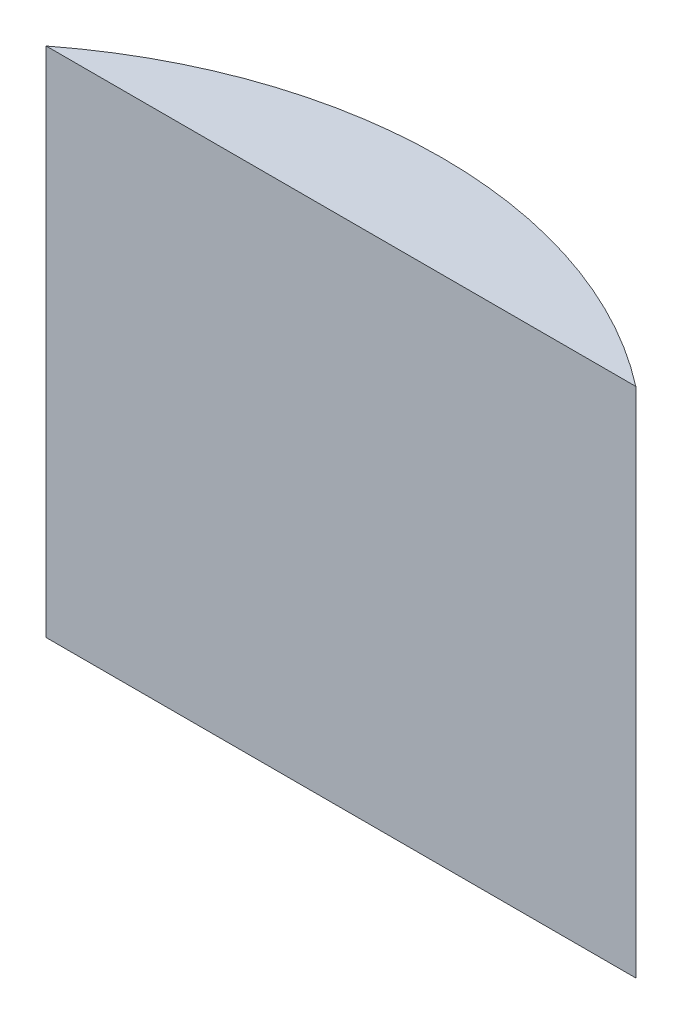
ISO-10303-21;
HEADER;
FILE_DESCRIPTION(('STEP AP214'),'2;1');
FILE_NAME('part.step','',(''),(''),'','','');
FILE_SCHEMA(('AUTOMOTIVE_DESIGN { 1 0 10303 214 1 1 1 1 }'));
ENDSEC;
DATA;
#1=APPLICATION_CONTEXT('core data for automotive mechanical design processes');
#2=APPLICATION_PROTOCOL_DEFINITION('international standard','automotive_design',2000,#1);
#3=PRODUCT_CONTEXT('',#1,'mechanical');
#4=PRODUCT('Part','Part','',(#3));
#5=PRODUCT_RELATED_PRODUCT_CATEGORY('part','',(#4));
#6=PRODUCT_DEFINITION_FORMATION('','',#4);
#7=PRODUCT_DEFINITION_CONTEXT('part definition',#1,'design');
#8=PRODUCT_DEFINITION('design','',#6,#7);
#9=PRODUCT_DEFINITION_SHAPE('','',#8);
#10=(LENGTH_UNIT() NAMED_UNIT(*) SI_UNIT(.MILLI.,.METRE.));
#11=(NAMED_UNIT(*) PLANE_ANGLE_UNIT() SI_UNIT($,.RADIAN.));
#12=(NAMED_UNIT(*) SI_UNIT($,.STERADIAN.) SOLID_ANGLE_UNIT());
#13=UNCERTAINTY_MEASURE_WITH_UNIT(LENGTH_MEASURE(1.E-05),#10,'distance_accuracy_value','');
#14=(GEOMETRIC_REPRESENTATION_CONTEXT(3) GLOBAL_UNCERTAINTY_ASSIGNED_CONTEXT((#13)) GLOBAL_UNIT_ASSIGNED_CONTEXT((#10,
#11,#12)) REPRESENTATION_CONTEXT('',''));
#15=CARTESIAN_POINT('',(0.,0.,0.));
#16=DIRECTION('',(0.,0.,1.));
#17=DIRECTION('',(1.,0.,0.));
#18=AXIS2_PLACEMENT_3D('',#15,#16,#17);
#19=CARTESIAN_POINT('',(0.,22.,0.));
#20=DIRECTION('',(0.,-1.,0.));
#21=DIRECTION('',(0.,0.,-1.));
#22=AXIS2_PLACEMENT_3D('',#19,#20,#21);
#23=CYLINDRICAL_SURFACE('',#22,18.7473691408307);
#24=CARTESIAN_POINT('',(0.,2.,0.));
#25=DIRECTION('',(0.,1.,0.));
#26=DIRECTION('',(0.,0.,-1.));
#27=AXIS2_PLACEMENT_3D('',#24,#25,#26);
#28=CIRCLE('',#27,18.7473691408307);
#29=CARTESIAN_POINT('',(11.5075562002787,2.,-14.8));
#30=VERTEX_POINT('',#29);
#31=CARTESIAN_POINT('',(-11.5075562002787,2.,-14.8));
#32=VERTEX_POINT('',#31);
#33=EDGE_CURVE('E60',#30,#32,#28,.T.);
#34=ORIENTED_EDGE('',*,*,#33,.T.);
#35=DIRECTION('',(0.,-1.,0.));
#36=VECTOR('',#35,1.);
#37=CARTESIAN_POINT('',(-11.5075562002787,22.,-14.8));
#38=LINE('',#37,#36);
#39=CARTESIAN_POINT('',(-11.5075562002787,22.,-14.8));
#40=VERTEX_POINT('',#39);
#41=EDGE_CURVE('E11',#40,#32,#38,.T.);
#42=ORIENTED_EDGE('',*,*,#41,.F.);
#43=CARTESIAN_POINT('',(0.,22.,0.));
#44=DIRECTION('',(0.,1.,0.));
#45=DIRECTION('',(0.,0.,-1.));
#46=AXIS2_PLACEMENT_3D('',#43,#44,#45);
#47=CIRCLE('',#46,18.7473691408307);
#48=CARTESIAN_POINT('',(11.5075562002787,22.,-14.8));
#49=VERTEX_POINT('',#48);
#50=EDGE_CURVE('E69',#49,#40,#47,.T.);
#51=ORIENTED_EDGE('',*,*,#50,.F.);
#52=DIRECTION('',(0.,-1.,0.));
#53=VECTOR('',#52,1.);
#54=CARTESIAN_POINT('',(11.5075562002787,22.,-14.8));
#55=LINE('',#54,#53);
#56=EDGE_CURVE('E43',#49,#30,#55,.T.);
#57=ORIENTED_EDGE('',*,*,#56,.T.);
#58=EDGE_LOOP('',(#34,#42,#51,#57));
#59=FACE_BOUND('',#58,.T.);
#60=ADVANCED_FACE('F35',(#59),#23,.T.);
#61=CARTESIAN_POINT('',(-11.5075562002787,22.,-14.8));
#62=DIRECTION('',(0.,0.,-1.));
#63=DIRECTION('',(-1.,0.,0.));
#64=AXIS2_PLACEMENT_3D('',#61,#62,#63);
#65=PLANE('',#64);
#66=DIRECTION('',(1.,0.,0.));
#67=VECTOR('',#66,1.);
#68=CARTESIAN_POINT('',(-11.5075562002787,2.,-14.8));
#69=LINE('',#68,#67);
#70=EDGE_CURVE('E58',#32,#30,#69,.T.);
#71=ORIENTED_EDGE('',*,*,#70,.T.);
#72=ORIENTED_EDGE('',*,*,#56,.F.);
#73=DIRECTION('',(1.,0.,0.));
#74=VECTOR('',#73,1.);
#75=CARTESIAN_POINT('',(-11.5075562002787,22.,-14.8));
#76=LINE('',#75,#74);
#77=EDGE_CURVE('E49',#40,#49,#76,.T.);
#78=ORIENTED_EDGE('',*,*,#77,.F.);
#79=ORIENTED_EDGE('',*,*,#41,.T.);
#80=EDGE_LOOP('',(#71,#72,#78,#79));
#81=FACE_BOUND('',#80,.T.);
#82=ADVANCED_FACE('F67',(#81),#65,.F.);
#83=CARTESIAN_POINT('',(0.,22.,0.));
#84=DIRECTION('',(0.,-1.,0.));
#85=DIRECTION('',(0.,0.,-1.));
#86=AXIS2_PLACEMENT_3D('',#83,#84,#85);
#87=PLANE('',#86);
#88=ORIENTED_EDGE('',*,*,#50,.T.);
#89=ORIENTED_EDGE('',*,*,#77,.T.);
#90=EDGE_LOOP('',(#88,#89));
#91=FACE_BOUND('',#90,.T.);
#92=ADVANCED_FACE('F73',(#91),#87,.F.);
#93=CARTESIAN_POINT('',(-30.3911254993636,2.,-25.7));
#94=DIRECTION('',(0.,1.,0.));
#95=DIRECTION('',(0.,0.,1.));
#96=AXIS2_PLACEMENT_3D('',#93,#94,#95);
#97=PLANE('',#96);
#98=ORIENTED_EDGE('',*,*,#70,.F.);
#99=ORIENTED_EDGE('',*,*,#33,.F.);
#100=EDGE_LOOP('',(#98,#99));
#101=FACE_BOUND('',#100,.T.);
#102=ADVANCED_FACE('F61',(#101),#97,.F.);
#103=CLOSED_SHELL('',(#60,#82,#92,#102));
#104=MANIFOLD_SOLID_BREP('B2',#103);
#105=ADVANCED_BREP_SHAPE_REPRESENTATION('',(#18,#104),#14);
#106=SHAPE_DEFINITION_REPRESENTATION(#9,#105);
ENDSEC;
END-ISO-10303-21;
